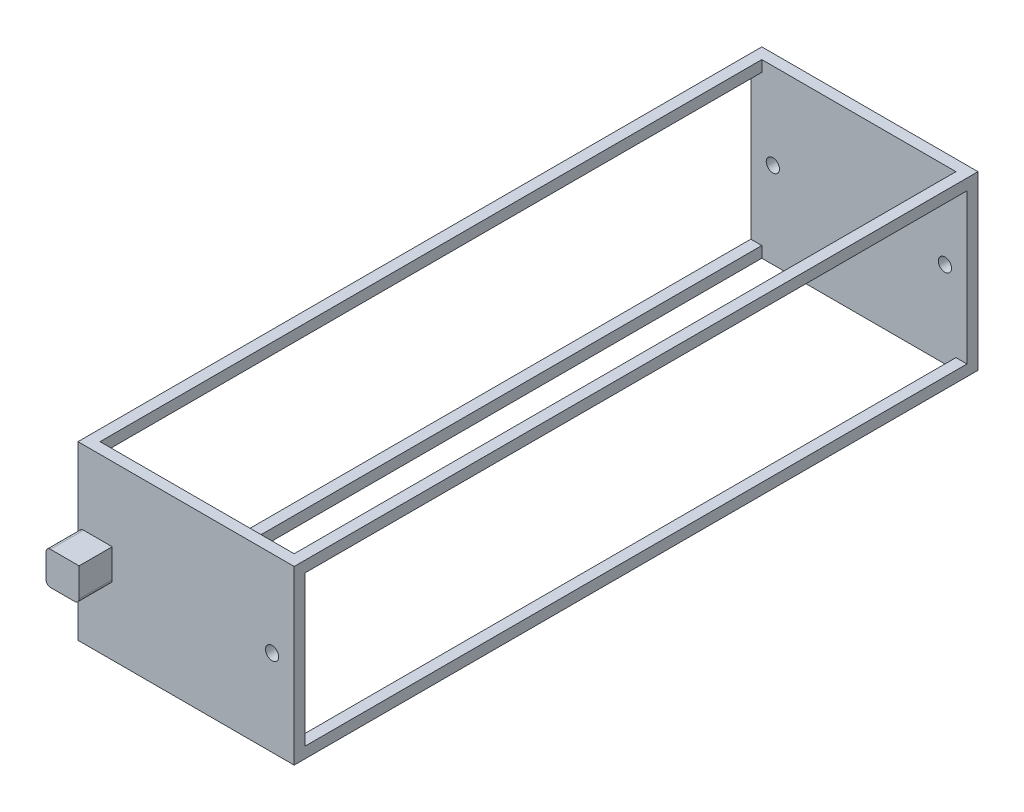
ISO-10303-21;
HEADER;
FILE_DESCRIPTION(('STEP AP214'),'2;1');
FILE_NAME('part.step','',(''),(''),'','','');
FILE_SCHEMA(('AUTOMOTIVE_DESIGN { 1 0 10303 214 1 1 1 1 }'));
ENDSEC;
DATA;
#1=APPLICATION_CONTEXT('core data for automotive mechanical design processes');
#2=APPLICATION_PROTOCOL_DEFINITION('international standard','automotive_design',2000,#1);
#3=PRODUCT_CONTEXT('',#1,'mechanical');
#4=PRODUCT('Part','Part','',(#3));
#5=PRODUCT_RELATED_PRODUCT_CATEGORY('part','',(#4));
#6=PRODUCT_DEFINITION_FORMATION('','',#4);
#7=PRODUCT_DEFINITION_CONTEXT('part definition',#1,'design');
#8=PRODUCT_DEFINITION('design','',#6,#7);
#9=PRODUCT_DEFINITION_SHAPE('','',#8);
#10=(LENGTH_UNIT() NAMED_UNIT(*) SI_UNIT(.MILLI.,.METRE.));
#11=(NAMED_UNIT(*) PLANE_ANGLE_UNIT() SI_UNIT($,.RADIAN.));
#12=(NAMED_UNIT(*) SI_UNIT($,.STERADIAN.) SOLID_ANGLE_UNIT());
#13=UNCERTAINTY_MEASURE_WITH_UNIT(LENGTH_MEASURE(1.E-05),#10,'distance_accuracy_value','');
#14=(GEOMETRIC_REPRESENTATION_CONTEXT(3) GLOBAL_UNCERTAINTY_ASSIGNED_CONTEXT((#13)) GLOBAL_UNIT_ASSIGNED_CONTEXT((#10,
#11,#12)) REPRESENTATION_CONTEXT('',''));
#15=CARTESIAN_POINT('',(0.,0.,0.));
#16=DIRECTION('',(0.,0.,1.));
#17=DIRECTION('',(1.,0.,0.));
#18=AXIS2_PLACEMENT_3D('',#15,#16,#17);
#19=CARTESIAN_POINT('',(30.,-175.,1560.));
#20=DIRECTION('',(0.,0.,-1.));
#21=DIRECTION('',(-1.,0.,0.));
#22=AXIS2_PLACEMENT_3D('',#19,#20,#21);
#23=CYLINDRICAL_SURFACE('',#22,13.7090130169661);
#24=CARTESIAN_POINT('',(30.,-175.,1560.));
#25=DIRECTION('',(0.,0.,1.));
#26=DIRECTION('',(1.,0.,0.));
#27=AXIS2_PLACEMENT_3D('',#24,#25,#26);
#28=CIRCLE('',#27,13.7090130169661);
#29=CARTESIAN_POINT('',(43.7090130169661,-175.,1560.));
#30=VERTEX_POINT('',#29);
#31=EDGE_CURVE('E131',#30,#30,#28,.T.);
#32=ORIENTED_EDGE('',*,*,#31,.F.);
#33=EDGE_LOOP('',(#32));
#34=FACE_BOUND('',#33,.T.);
#35=CARTESIAN_POINT('',(30.,-175.,1550.));
#36=DIRECTION('',(0.,0.,1.));
#37=DIRECTION('',(1.,0.,0.));
#38=AXIS2_PLACEMENT_3D('',#35,#36,#37);
#39=CIRCLE('',#38,13.7090130169661);
#40=CARTESIAN_POINT('',(43.7090130169661,-175.,1550.));
#41=VERTEX_POINT('',#40);
#42=EDGE_CURVE('E127',#41,#41,#39,.T.);
#43=ORIENTED_EDGE('',*,*,#42,.T.);
#44=EDGE_LOOP('',(#43));
#45=FACE_BOUND('',#44,.T.);
#46=ADVANCED_FACE('F45',(#34,#45),#23,.T.);
#47=CARTESIAN_POINT('',(30.,-175.,1550.));
#48=DIRECTION('',(0.,0.,1.));
#49=DIRECTION('',(1.,0.,0.));
#50=AXIS2_PLACEMENT_3D('',#47,#48,#49);
#51=PLANE('',#50);
#52=ORIENTED_EDGE('',*,*,#42,.F.);
#53=EDGE_LOOP('',(#52));
#54=FACE_BOUND('',#53,.T.);
#55=ADVANCED_FACE('F191',(#54),#51,.F.);
#56=CARTESIAN_POINT('',(67.5,-137.5,1635.));
#57=DIRECTION('',(-1.,0.,0.));
#58=DIRECTION('',(0.,-1.,0.));
#59=AXIS2_PLACEMENT_3D('',#56,#57,#58);
#60=PLANE('',#59);
#61=DIRECTION('',(0.,1.,0.));
#62=VECTOR('',#61,1.);
#63=CARTESIAN_POINT('',(67.5,-137.5,1635.));
#64=LINE('',#63,#62);
#65=CARTESIAN_POINT('',(67.5,-202.5,1635.));
#66=VERTEX_POINT('',#65);
#67=CARTESIAN_POINT('',(67.5,-137.5,1635.));
#68=VERTEX_POINT('',#67);
#69=EDGE_CURVE('E102',#66,#68,#64,.T.);
#70=ORIENTED_EDGE('',*,*,#69,.F.);
#71=DIRECTION('',(0.,0.,-1.));
#72=VECTOR('',#71,1.);
#73=CARTESIAN_POINT('',(67.5,-202.5,1635.));
#74=LINE('',#73,#72);
#75=CARTESIAN_POINT('',(67.5,-202.5,1560.));
#76=VERTEX_POINT('',#75);
#77=EDGE_CURVE('E138',#66,#76,#74,.T.);
#78=ORIENTED_EDGE('',*,*,#77,.T.);
#79=DIRECTION('',(0.,1.,0.));
#80=VECTOR('',#79,1.);
#81=CARTESIAN_POINT('',(67.5,-137.5,1560.));
#82=LINE('',#81,#80);
#83=CARTESIAN_POINT('',(67.5,-137.5,1560.));
#84=VERTEX_POINT('',#83);
#85=EDGE_CURVE('E125',#76,#84,#82,.T.);
#86=ORIENTED_EDGE('',*,*,#85,.T.);
#87=DIRECTION('',(0.,0.,-1.));
#88=VECTOR('',#87,1.);
#89=CARTESIAN_POINT('',(67.5,-137.5,1635.));
#90=LINE('',#89,#88);
#91=EDGE_CURVE('E119',#68,#84,#90,.T.);
#92=ORIENTED_EDGE('',*,*,#91,.F.);
#93=EDGE_LOOP('',(#70,#78,#86,#92));
#94=FACE_BOUND('',#93,.T.);
#95=ADVANCED_FACE('F123',(#94),#60,.F.);
#96=CARTESIAN_POINT('',(-7.49999999999998,-137.5,1635.));
#97=DIRECTION('',(0.,-1.,0.));
#98=DIRECTION('',(0.,0.,-1.));
#99=AXIS2_PLACEMENT_3D('',#96,#97,#98);
#100=PLANE('',#99);
#101=DIRECTION('',(-1.,0.,0.));
#102=VECTOR('',#101,1.);
#103=CARTESIAN_POINT('',(-7.49999999999998,-137.5,1560.));
#104=LINE('',#103,#102);
#105=CARTESIAN_POINT('',(2.50000000000002,-137.5,1560.));
#106=VERTEX_POINT('',#105);
#107=EDGE_CURVE('E166',#84,#106,#104,.T.);
#108=ORIENTED_EDGE('',*,*,#107,.T.);
#109=DIRECTION('',(0.,0.,-1.));
#110=VECTOR('',#109,1.);
#111=CARTESIAN_POINT('',(2.50000000000002,-137.5,1635.));
#112=LINE('',#111,#110);
#113=CARTESIAN_POINT('',(2.50000000000002,-137.5,1635.));
#114=VERTEX_POINT('',#113);
#115=EDGE_CURVE('E12',#106,#114,#112,.F.);
#116=ORIENTED_EDGE('',*,*,#115,.T.);
#117=DIRECTION('',(-1.,0.,0.));
#118=VECTOR('',#117,1.);
#119=CARTESIAN_POINT('',(-7.49999999999998,-137.5,1635.));
#120=LINE('',#119,#118);
#121=EDGE_CURVE('E106',#68,#114,#120,.T.);
#122=ORIENTED_EDGE('',*,*,#121,.F.);
#123=ORIENTED_EDGE('',*,*,#91,.T.);
#124=EDGE_LOOP('',(#108,#116,#122,#123));
#125=FACE_BOUND('',#124,.T.);
#126=ADVANCED_FACE('F118',(#125),#100,.F.);
#127=CARTESIAN_POINT('',(-7.49999999999998,-137.5,1635.));
#128=DIRECTION('',(1.,0.,0.));
#129=DIRECTION('',(0.,1.,0.));
#130=AXIS2_PLACEMENT_3D('',#127,#128,#129);
#131=PLANE('',#130);
#132=DIRECTION('',(0.,-1.,0.));
#133=VECTOR('',#132,1.);
#134=CARTESIAN_POINT('',(-7.49999999999998,-137.5,1560.));
#135=LINE('',#134,#133);
#136=CARTESIAN_POINT('',(-7.49999999999998,-147.5,1560.));
#137=VERTEX_POINT('',#136);
#138=CARTESIAN_POINT('',(-7.49999999999997,-202.5,1560.));
#139=VERTEX_POINT('',#138);
#140=EDGE_CURVE('E161',#137,#139,#135,.T.);
#141=ORIENTED_EDGE('',*,*,#140,.T.);
#142=DIRECTION('',(0.,0.,-1.));
#143=VECTOR('',#142,1.);
#144=CARTESIAN_POINT('',(-7.49999999999997,-202.5,1635.));
#145=LINE('',#144,#143);
#146=CARTESIAN_POINT('',(-7.49999999999997,-202.5,1635.));
#147=VERTEX_POINT('',#146);
#148=EDGE_CURVE('E53',#139,#147,#145,.F.);
#149=ORIENTED_EDGE('',*,*,#148,.T.);
#150=DIRECTION('',(0.,-1.,0.));
#151=VECTOR('',#150,1.);
#152=CARTESIAN_POINT('',(-7.49999999999998,-137.5,1635.));
#153=LINE('',#152,#151);
#154=CARTESIAN_POINT('',(-7.49999999999998,-147.5,1635.));
#155=VERTEX_POINT('',#154);
#156=EDGE_CURVE('E121',#155,#147,#153,.T.);
#157=ORIENTED_EDGE('',*,*,#156,.F.);
#158=DIRECTION('',(0.,0.,-1.));
#159=VECTOR('',#158,1.);
#160=CARTESIAN_POINT('',(-7.49999999999998,-147.5,1635.));
#161=LINE('',#160,#159);
#162=EDGE_CURVE('E156',#155,#137,#161,.T.);
#163=ORIENTED_EDGE('',*,*,#162,.T.);
#164=EDGE_LOOP('',(#141,#149,#157,#163));
#165=FACE_BOUND('',#164,.T.);
#166=ADVANCED_FACE('F160',(#165),#131,.F.);
#167=CARTESIAN_POINT('',(-7.49999999999997,-212.5,1635.));
#168=DIRECTION('',(0.,1.,0.));
#169=DIRECTION('',(0.,0.,1.));
#170=AXIS2_PLACEMENT_3D('',#167,#168,#169);
#171=PLANE('',#170);
#172=DIRECTION('',(1.,0.,0.));
#173=VECTOR('',#172,1.);
#174=CARTESIAN_POINT('',(-7.49999999999997,-212.5,1560.));
#175=LINE('',#174,#173);
#176=CARTESIAN_POINT('',(2.50000000000003,-212.5,1560.));
#177=VERTEX_POINT('',#176);
#178=CARTESIAN_POINT('',(57.5,-212.5,1560.));
#179=VERTEX_POINT('',#178);
#180=EDGE_CURVE('E113',#177,#179,#175,.T.);
#181=ORIENTED_EDGE('',*,*,#180,.T.);
#182=DIRECTION('',(0.,0.,-1.));
#183=VECTOR('',#182,1.);
#184=CARTESIAN_POINT('',(57.5,-212.5,1635.));
#185=LINE('',#184,#183);
#186=CARTESIAN_POINT('',(57.5,-212.5,1635.));
#187=VERTEX_POINT('',#186);
#188=EDGE_CURVE('E150',#179,#187,#185,.F.);
#189=ORIENTED_EDGE('',*,*,#188,.T.);
#190=DIRECTION('',(1.,0.,0.));
#191=VECTOR('',#190,1.);
#192=CARTESIAN_POINT('',(-7.49999999999997,-212.5,1635.));
#193=LINE('',#192,#191);
#194=CARTESIAN_POINT('',(2.50000000000003,-212.5,1635.));
#195=VERTEX_POINT('',#194);
#196=EDGE_CURVE('E128',#195,#187,#193,.T.);
#197=ORIENTED_EDGE('',*,*,#196,.F.);
#198=DIRECTION('',(0.,0.,-1.));
#199=VECTOR('',#198,1.);
#200=CARTESIAN_POINT('',(2.50000000000003,-212.5,1635.));
#201=LINE('',#200,#199);
#202=EDGE_CURVE('E147',#195,#177,#201,.T.);
#203=ORIENTED_EDGE('',*,*,#202,.T.);
#204=EDGE_LOOP('',(#181,#189,#197,#203));
#205=FACE_BOUND('',#204,.T.);
#206=ADVANCED_FACE('F177',(#205),#171,.F.);
#207=CARTESIAN_POINT('',(0.,0.,1635.));
#208=DIRECTION('',(0.,0.,1.));
#209=DIRECTION('',(1.,0.,0.));
#210=AXIS2_PLACEMENT_3D('',#207,#208,#209);
#211=PLANE('',#210);
#212=ORIENTED_EDGE('',*,*,#196,.T.);
#213=CARTESIAN_POINT('',(57.5,-202.5,1635.));
#214=DIRECTION('',(0.,0.,1.));
#215=DIRECTION('',(1.,0.,0.));
#216=AXIS2_PLACEMENT_3D('',#213,#214,#215);
#217=CIRCLE('',#216,10.);
#218=EDGE_CURVE('E108',#187,#66,#217,.T.);
#219=ORIENTED_EDGE('',*,*,#218,.T.);
#220=ORIENTED_EDGE('',*,*,#69,.T.);
#221=ORIENTED_EDGE('',*,*,#121,.T.);
#222=CARTESIAN_POINT('',(2.50000000000002,-147.5,1635.));
#223=DIRECTION('',(0.,0.,1.));
#224=DIRECTION('',(1.,0.,0.));
#225=AXIS2_PLACEMENT_3D('',#222,#223,#224);
#226=CIRCLE('',#225,10.);
#227=EDGE_CURVE('E66',#114,#155,#226,.T.);
#228=ORIENTED_EDGE('',*,*,#227,.T.);
#229=ORIENTED_EDGE('',*,*,#156,.T.);
#230=CARTESIAN_POINT('',(2.50000000000003,-202.5,1635.));
#231=DIRECTION('',(0.,0.,1.));
#232=DIRECTION('',(1.,0.,0.));
#233=AXIS2_PLACEMENT_3D('',#230,#231,#232);
#234=CIRCLE('',#233,10.);
#235=EDGE_CURVE('E153',#147,#195,#234,.T.);
#236=ORIENTED_EDGE('',*,*,#235,.T.);
#237=EDGE_LOOP('',(#212,#219,#220,#221,#228,#229,#236));
#238=FACE_BOUND('',#237,.T.);
#239=ADVANCED_FACE('F105',(#238),#211,.T.);
#240=CARTESIAN_POINT('',(0.,0.,1560.));
#241=DIRECTION('',(0.,0.,1.));
#242=DIRECTION('',(1.,0.,0.));
#243=AXIS2_PLACEMENT_3D('',#240,#241,#242);
#244=PLANE('',#243);
#245=ORIENTED_EDGE('',*,*,#31,.T.);
#246=EDGE_LOOP('',(#245));
#247=FACE_BOUND('',#246,.T.);
#248=ORIENTED_EDGE('',*,*,#85,.F.);
#249=CARTESIAN_POINT('',(57.5,-202.5,1560.));
#250=DIRECTION('',(0.,0.,1.));
#251=DIRECTION('',(1.,0.,0.));
#252=AXIS2_PLACEMENT_3D('',#249,#250,#251);
#253=CIRCLE('',#252,10.);
#254=EDGE_CURVE('E145',#76,#179,#253,.F.);
#255=ORIENTED_EDGE('',*,*,#254,.T.);
#256=ORIENTED_EDGE('',*,*,#180,.F.);
#257=CARTESIAN_POINT('',(2.50000000000003,-202.5,1560.));
#258=DIRECTION('',(0.,0.,1.));
#259=DIRECTION('',(1.,0.,0.));
#260=AXIS2_PLACEMENT_3D('',#257,#258,#259);
#261=CIRCLE('',#260,10.);
#262=EDGE_CURVE('E143',#177,#139,#261,.F.);
#263=ORIENTED_EDGE('',*,*,#262,.T.);
#264=ORIENTED_EDGE('',*,*,#140,.F.);
#265=CARTESIAN_POINT('',(2.50000000000002,-147.5,1560.));
#266=DIRECTION('',(0.,0.,1.));
#267=DIRECTION('',(1.,0.,0.));
#268=AXIS2_PLACEMENT_3D('',#265,#266,#267);
#269=CIRCLE('',#268,10.);
#270=EDGE_CURVE('E141',#137,#106,#269,.F.);
#271=ORIENTED_EDGE('',*,*,#270,.T.);
#272=ORIENTED_EDGE('',*,*,#107,.F.);
#273=EDGE_LOOP('',(#248,#255,#256,#263,#264,#271,#272));
#274=FACE_BOUND('',#273,.T.);
#275=ADVANCED_FACE('F164',(#247,#274),#244,.F.);
#276=CARTESIAN_POINT('',(57.5,-202.5,1635.));
#277=DIRECTION('',(0.,0.,-1.));
#278=DIRECTION('',(-1.,0.,0.));
#279=AXIS2_PLACEMENT_3D('',#276,#277,#278);
#280=CYLINDRICAL_SURFACE('',#279,10.);
#281=ORIENTED_EDGE('',*,*,#218,.F.);
#282=ORIENTED_EDGE('',*,*,#188,.F.);
#283=ORIENTED_EDGE('',*,*,#254,.F.);
#284=ORIENTED_EDGE('',*,*,#77,.F.);
#285=EDGE_LOOP('',(#281,#282,#283,#284));
#286=FACE_BOUND('',#285,.T.);
#287=ADVANCED_FACE('F180',(#286),#280,.T.);
#288=CARTESIAN_POINT('',(2.50000000000003,-202.5,1635.));
#289=DIRECTION('',(0.,0.,-1.));
#290=DIRECTION('',(-1.,0.,0.));
#291=AXIS2_PLACEMENT_3D('',#288,#289,#290);
#292=CYLINDRICAL_SURFACE('',#291,10.);
#293=ORIENTED_EDGE('',*,*,#235,.F.);
#294=ORIENTED_EDGE('',*,*,#148,.F.);
#295=ORIENTED_EDGE('',*,*,#262,.F.);
#296=ORIENTED_EDGE('',*,*,#202,.F.);
#297=EDGE_LOOP('',(#293,#294,#295,#296));
#298=FACE_BOUND('',#297,.T.);
#299=ADVANCED_FACE('F175',(#298),#292,.T.);
#300=CARTESIAN_POINT('',(2.50000000000002,-147.5,1635.));
#301=DIRECTION('',(0.,0.,-1.));
#302=DIRECTION('',(-1.,0.,0.));
#303=AXIS2_PLACEMENT_3D('',#300,#301,#302);
#304=CYLINDRICAL_SURFACE('',#303,10.);
#305=ORIENTED_EDGE('',*,*,#227,.F.);
#306=ORIENTED_EDGE('',*,*,#115,.F.);
#307=ORIENTED_EDGE('',*,*,#270,.F.);
#308=ORIENTED_EDGE('',*,*,#162,.F.);
#309=EDGE_LOOP('',(#305,#306,#307,#308));
#310=FACE_BOUND('',#309,.T.);
#311=ADVANCED_FACE('F47',(#310),#304,.T.);
#312=CLOSED_SHELL('',(#46,#55,#95,#126,#166,#206,#239,#275,#287,#299,#311));
#313=MANIFOLD_SOLID_BREP('B2',#312);
#314=CARTESIAN_POINT('',(0.,0.,25.));
#315=DIRECTION('',(0.,0.,-1.));
#316=DIRECTION('',(-1.,0.,0.));
#317=AXIS2_PLACEMENT_3D('',#314,#315,#316);
#318=PLANE('',#317);
#319=CARTESIAN_POINT('',(420.,-175.,25.));
#320=DIRECTION('',(0.,0.,-1.));
#321=DIRECTION('',(-1.,0.,0.));
#322=AXIS2_PLACEMENT_3D('',#319,#320,#321);
#323=CIRCLE('',#322,15.);
#324=CARTESIAN_POINT('',(405.,-175.,25.));
#325=VERTEX_POINT('',#324);
#326=EDGE_CURVE('E416',#325,#325,#323,.T.);
#327=ORIENTED_EDGE('',*,*,#326,.T.);
#328=EDGE_LOOP('',(#327));
#329=FACE_BOUND('',#328,.T.);
#330=CARTESIAN_POINT('',(30.,-175.,25.));
#331=DIRECTION('',(0.,0.,-1.));
#332=DIRECTION('',(-1.,0.,0.));
#333=AXIS2_PLACEMENT_3D('',#330,#331,#332);
#334=CIRCLE('',#333,15.);
#335=CARTESIAN_POINT('',(15.,-175.,25.));
#336=VERTEX_POINT('',#335);
#337=EDGE_CURVE('E782',#336,#336,#334,.T.);
#338=ORIENTED_EDGE('',*,*,#337,.T.);
#339=EDGE_LOOP('',(#338));
#340=FACE_BOUND('',#339,.T.);
#341=DIRECTION('',(0.,1.,0.));
#342=VECTOR('',#341,1.);
#343=CARTESIAN_POINT('',(4.99999999999999,-370.,25.));
#344=LINE('',#343,#342);
#345=CARTESIAN_POINT('',(4.99999999999999,-370.,25.));
#346=VERTEX_POINT('',#345);
#347=CARTESIAN_POINT('',(5.,-345.,25.));
#348=VERTEX_POINT('',#347);
#349=EDGE_CURVE('E421',#346,#348,#344,.T.);
#350=ORIENTED_EDGE('',*,*,#349,.F.);
#351=DIRECTION('',(1.,0.,0.));
#352=VECTOR('',#351,1.);
#353=CARTESIAN_POINT('',(-20.,-370.,25.));
#354=LINE('',#353,#352);
#355=CARTESIAN_POINT('',(445.,-370.,25.));
#356=VERTEX_POINT('',#355);
#357=EDGE_CURVE('E515',#346,#356,#354,.T.);
#358=ORIENTED_EDGE('',*,*,#357,.T.);
#359=DIRECTION('',(0.,-1.,0.));
#360=VECTOR('',#359,1.);
#361=CARTESIAN_POINT('',(445.,-370.,25.));
#362=LINE('',#361,#360);
#363=CARTESIAN_POINT('',(445.,-345.,25.));
#364=VERTEX_POINT('',#363);
#365=EDGE_CURVE('E452',#364,#356,#362,.T.);
#366=ORIENTED_EDGE('',*,*,#365,.F.);
#367=DIRECTION('',(-1.,0.,0.));
#368=VECTOR('',#367,1.);
#369=CARTESIAN_POINT('',(470.,-345.,25.));
#370=LINE('',#369,#368);
#371=CARTESIAN_POINT('',(470.,-345.,25.));
#372=VERTEX_POINT('',#371);
#373=EDGE_CURVE('E447',#372,#364,#370,.T.);
#374=ORIENTED_EDGE('',*,*,#373,.F.);
#375=DIRECTION('',(0.,1.,0.));
#376=VECTOR('',#375,1.);
#377=CARTESIAN_POINT('',(470.,20.,25.));
#378=LINE('',#377,#376);
#379=CARTESIAN_POINT('',(470.,-5.00000000000005,25.));
#380=VERTEX_POINT('',#379);
#381=EDGE_CURVE('E517',#372,#380,#378,.T.);
#382=ORIENTED_EDGE('',*,*,#381,.T.);
#383=DIRECTION('',(1.,0.,0.));
#384=VECTOR('',#383,1.);
#385=CARTESIAN_POINT('',(470.,-5.00000000000005,25.));
#386=LINE('',#385,#384);
#387=CARTESIAN_POINT('',(445.,-5.00000000000005,25.));
#388=VERTEX_POINT('',#387);
#389=EDGE_CURVE('E473',#388,#380,#386,.T.);
#390=ORIENTED_EDGE('',*,*,#389,.F.);
#391=DIRECTION('',(0.,-1.,0.));
#392=VECTOR('',#391,1.);
#393=CARTESIAN_POINT('',(445.,20.,25.));
#394=LINE('',#393,#392);
#395=CARTESIAN_POINT('',(445.,20.,25.));
#396=VERTEX_POINT('',#395);
#397=EDGE_CURVE('E468',#396,#388,#394,.T.);
#398=ORIENTED_EDGE('',*,*,#397,.F.);
#399=DIRECTION('',(-1.,0.,0.));
#400=VECTOR('',#399,1.);
#401=CARTESIAN_POINT('',(-20.,20.,25.));
#402=LINE('',#401,#400);
#403=CARTESIAN_POINT('',(5.00000000000002,20.,25.));
#404=VERTEX_POINT('',#403);
#405=EDGE_CURVE('E511',#396,#404,#402,.T.);
#406=ORIENTED_EDGE('',*,*,#405,.T.);
#407=DIRECTION('',(0.,1.,0.));
#408=VECTOR('',#407,1.);
#409=CARTESIAN_POINT('',(5.00000000000002,20.,25.));
#410=LINE('',#409,#408);
#411=CARTESIAN_POINT('',(5.00000000000002,-5.00000000000002,25.));
#412=VERTEX_POINT('',#411);
#413=EDGE_CURVE('E494',#412,#404,#410,.T.);
#414=ORIENTED_EDGE('',*,*,#413,.F.);
#415=DIRECTION('',(1.,0.,0.));
#416=VECTOR('',#415,1.);
#417=CARTESIAN_POINT('',(-20.,-5.00000000000002,25.));
#418=LINE('',#417,#416);
#419=CARTESIAN_POINT('',(-20.,-5.00000000000002,25.));
#420=VERTEX_POINT('',#419);
#421=EDGE_CURVE('E489',#420,#412,#418,.T.);
#422=ORIENTED_EDGE('',*,*,#421,.F.);
#423=DIRECTION('',(0.,-1.,0.));
#424=VECTOR('',#423,1.);
#425=CARTESIAN_POINT('',(-20.,20.,25.));
#426=LINE('',#425,#424);
#427=CARTESIAN_POINT('',(-20.,-345.,25.));
#428=VERTEX_POINT('',#427);
#429=EDGE_CURVE('E296',#420,#428,#426,.T.);
#430=ORIENTED_EDGE('',*,*,#429,.T.);
#431=DIRECTION('',(-1.,0.,0.));
#432=VECTOR('',#431,1.);
#433=CARTESIAN_POINT('',(-20.,-345.,25.));
#434=LINE('',#433,#432);
#435=EDGE_CURVE('E291',#348,#428,#434,.T.);
#436=ORIENTED_EDGE('',*,*,#435,.F.);
#437=EDGE_LOOP('',(#350,#358,#366,#374,#382,#390,#398,#406,#414,#422,#430,#436));
#438=FACE_BOUND('',#437,.T.);
#439=ADVANCED_FACE('F276',(#329,#340,#438),#318,.F.);
#440=CARTESIAN_POINT('',(-20.,20.,25.));
#441=DIRECTION('',(0.,-1.,0.));
#442=DIRECTION('',(0.,0.,-1.));
#443=AXIS2_PLACEMENT_3D('',#440,#441,#442);
#444=PLANE('',#443);
#445=DIRECTION('',(0.,0.,-1.));
#446=VECTOR('',#445,1.);
#447=CARTESIAN_POINT('',(-20.,20.,25.));
#448=LINE('',#447,#446);
#449=CARTESIAN_POINT('',(-20.,20.,1550.));
#450=VERTEX_POINT('',#449);
#451=CARTESIAN_POINT('',(-20.,20.,0.));
#452=VERTEX_POINT('',#451);
#453=EDGE_CURVE('E43',#450,#452,#448,.T.);
#454=ORIENTED_EDGE('',*,*,#453,.F.);
#455=DIRECTION('',(-1.,0.,0.));
#456=VECTOR('',#455,1.);
#457=CARTESIAN_POINT('',(-20.,20.,1550.));
#458=LINE('',#457,#456);
#459=CARTESIAN_POINT('',(470.,20.,1550.));
#460=VERTEX_POINT('',#459);
#461=EDGE_CURVE('E409',#460,#450,#458,.T.);
#462=ORIENTED_EDGE('',*,*,#461,.F.);
#463=DIRECTION('',(0.,0.,-1.));
#464=VECTOR('',#463,1.);
#465=CARTESIAN_POINT('',(470.,20.,25.));
#466=LINE('',#465,#464);
#467=CARTESIAN_POINT('',(470.,20.,0.));
#468=VERTEX_POINT('',#467);
#469=EDGE_CURVE('E519',#460,#468,#466,.T.);
#470=ORIENTED_EDGE('',*,*,#469,.T.);
#471=DIRECTION('',(-1.,0.,0.));
#472=VECTOR('',#471,1.);
#473=CARTESIAN_POINT('',(-20.,20.,0.));
#474=LINE('',#473,#472);
#475=EDGE_CURVE('E510',#468,#452,#474,.T.);
#476=ORIENTED_EDGE('',*,*,#475,.T.);
#477=EDGE_LOOP('',(#454,#462,#470,#476));
#478=FACE_BOUND('',#477,.T.);
#479=DIRECTION('',(-1.,0.,0.));
#480=VECTOR('',#479,1.);
#481=CARTESIAN_POINT('',(-20.,20.,1525.));
#482=LINE('',#481,#480);
#483=CARTESIAN_POINT('',(445.,20.,1525.));
#484=VERTEX_POINT('',#483);
#485=CARTESIAN_POINT('',(5.00000000000002,20.,1525.));
#486=VERTEX_POINT('',#485);
#487=EDGE_CURVE('E410',#484,#486,#482,.T.);
#488=ORIENTED_EDGE('',*,*,#487,.T.);
#489=DIRECTION('',(0.,0.,-1.));
#490=VECTOR('',#489,1.);
#491=CARTESIAN_POINT('',(5.00000000000002,20.,1525.));
#492=LINE('',#491,#490);
#493=EDGE_CURVE('E497',#486,#404,#492,.T.);
#494=ORIENTED_EDGE('',*,*,#493,.T.);
#495=ORIENTED_EDGE('',*,*,#405,.F.);
#496=DIRECTION('',(0.,0.,-1.));
#497=VECTOR('',#496,1.);
#498=CARTESIAN_POINT('',(445.,20.,1525.));
#499=LINE('',#498,#497);
#500=EDGE_CURVE('E486',#484,#396,#499,.T.);
#501=ORIENTED_EDGE('',*,*,#500,.F.);
#502=EDGE_LOOP('',(#488,#494,#495,#501));
#503=FACE_BOUND('',#502,.T.);
#504=ADVANCED_FACE('F278',(#478,#503),#444,.F.);
#505=CARTESIAN_POINT('',(-20.,20.,25.));
#506=DIRECTION('',(1.,0.,0.));
#507=DIRECTION('',(0.,0.,-1.));
#508=AXIS2_PLACEMENT_3D('',#505,#506,#507);
#509=PLANE('',#508);
#510=DIRECTION('',(0.,0.,-1.));
#511=VECTOR('',#510,1.);
#512=CARTESIAN_POINT('',(-20.,-5.00000000000002,1525.));
#513=LINE('',#512,#511);
#514=CARTESIAN_POINT('',(-20.,-5.00000000000002,1525.));
#515=VERTEX_POINT('',#514);
#516=EDGE_CURVE('E507',#515,#420,#513,.T.);
#517=ORIENTED_EDGE('',*,*,#516,.F.);
#518=DIRECTION('',(0.,-1.,0.));
#519=VECTOR('',#518,1.);
#520=CARTESIAN_POINT('',(-20.,20.,1525.));
#521=LINE('',#520,#519);
#522=CARTESIAN_POINT('',(-20.,-345.,1525.));
#523=VERTEX_POINT('',#522);
#524=EDGE_CURVE('E422',#515,#523,#521,.T.);
#525=ORIENTED_EDGE('',*,*,#524,.T.);
#526=DIRECTION('',(0.,0.,-1.));
#527=VECTOR('',#526,1.);
#528=CARTESIAN_POINT('',(-20.,-345.,1525.));
#529=LINE('',#528,#527);
#530=EDGE_CURVE('E436',#523,#428,#529,.T.);
#531=ORIENTED_EDGE('',*,*,#530,.T.);
#532=ORIENTED_EDGE('',*,*,#429,.F.);
#533=EDGE_LOOP('',(#517,#525,#531,#532));
#534=FACE_BOUND('',#533,.T.);
#535=DIRECTION('',(0.,-1.,0.));
#536=VECTOR('',#535,1.);
#537=CARTESIAN_POINT('',(-20.,20.,0.));
#538=LINE('',#537,#536);
#539=CARTESIAN_POINT('',(-20.,-370.,0.));
#540=VERTEX_POINT('',#539);
#541=EDGE_CURVE('E392',#452,#540,#538,.T.);
#542=ORIENTED_EDGE('',*,*,#541,.T.);
#543=DIRECTION('',(0.,0.,-1.));
#544=VECTOR('',#543,1.);
#545=CARTESIAN_POINT('',(-20.,-370.,25.));
#546=LINE('',#545,#544);
#547=CARTESIAN_POINT('',(-20.,-370.,1550.));
#548=VERTEX_POINT('',#547);
#549=EDGE_CURVE('E284',#548,#540,#546,.T.);
#550=ORIENTED_EDGE('',*,*,#549,.F.);
#551=DIRECTION('',(0.,-1.,0.));
#552=VECTOR('',#551,1.);
#553=CARTESIAN_POINT('',(-20.,20.,1550.));
#554=LINE('',#553,#552);
#555=EDGE_CURVE('E391',#450,#548,#554,.T.);
#556=ORIENTED_EDGE('',*,*,#555,.F.);
#557=ORIENTED_EDGE('',*,*,#453,.T.);
#558=EDGE_LOOP('',(#542,#550,#556,#557));
#559=FACE_BOUND('',#558,.T.);
#560=ADVANCED_FACE('F389',(#534,#559),#509,.F.);
#561=CARTESIAN_POINT('',(-20.,-370.,25.));
#562=DIRECTION('',(0.,1.,0.));
#563=DIRECTION('',(0.,0.,1.));
#564=AXIS2_PLACEMENT_3D('',#561,#562,#563);
#565=PLANE('',#564);
#566=DIRECTION('',(0.,0.,-1.));
#567=VECTOR('',#566,1.);
#568=CARTESIAN_POINT('',(470.,-370.,25.));
#569=LINE('',#568,#567);
#570=CARTESIAN_POINT('',(470.,-370.,1550.));
#571=VERTEX_POINT('',#570);
#572=CARTESIAN_POINT('',(470.,-370.,0.));
#573=VERTEX_POINT('',#572);
#574=EDGE_CURVE('E395',#571,#573,#569,.T.);
#575=ORIENTED_EDGE('',*,*,#574,.F.);
#576=DIRECTION('',(1.,0.,0.));
#577=VECTOR('',#576,1.);
#578=CARTESIAN_POINT('',(-20.,-370.,1550.));
#579=LINE('',#578,#577);
#580=EDGE_CURVE('E397',#548,#571,#579,.T.);
#581=ORIENTED_EDGE('',*,*,#580,.F.);
#582=ORIENTED_EDGE('',*,*,#549,.T.);
#583=DIRECTION('',(1.,0.,0.));
#584=VECTOR('',#583,1.);
#585=CARTESIAN_POINT('',(-20.,-370.,0.));
#586=LINE('',#585,#584);
#587=EDGE_CURVE('E523',#540,#573,#586,.T.);
#588=ORIENTED_EDGE('',*,*,#587,.T.);
#589=EDGE_LOOP('',(#575,#581,#582,#588));
#590=FACE_BOUND('',#589,.T.);
#591=DIRECTION('',(1.,0.,0.));
#592=VECTOR('',#591,1.);
#593=CARTESIAN_POINT('',(-20.,-370.,1525.));
#594=LINE('',#593,#592);
#595=CARTESIAN_POINT('',(5.,-370.,1525.));
#596=VERTEX_POINT('',#595);
#597=CARTESIAN_POINT('',(445.,-370.,1525.));
#598=VERTEX_POINT('',#597);
#599=EDGE_CURVE('E425',#596,#598,#594,.T.);
#600=ORIENTED_EDGE('',*,*,#599,.T.);
#601=DIRECTION('',(0.,0.,-1.));
#602=VECTOR('',#601,1.);
#603=CARTESIAN_POINT('',(445.,-370.,1525.));
#604=LINE('',#603,#602);
#605=EDGE_CURVE('E455',#598,#356,#604,.T.);
#606=ORIENTED_EDGE('',*,*,#605,.T.);
#607=ORIENTED_EDGE('',*,*,#357,.F.);
#608=DIRECTION('',(0.,0.,-1.));
#609=VECTOR('',#608,1.);
#610=CARTESIAN_POINT('',(4.99999999999999,-370.,1525.));
#611=LINE('',#610,#609);
#612=EDGE_CURVE('E444',#596,#346,#611,.T.);
#613=ORIENTED_EDGE('',*,*,#612,.F.);
#614=EDGE_LOOP('',(#600,#606,#607,#613));
#615=FACE_BOUND('',#614,.T.);
#616=ADVANCED_FACE('F398',(#590,#615),#565,.F.);
#617=CARTESIAN_POINT('',(470.,20.,25.));
#618=DIRECTION('',(-1.,0.,0.));
#619=DIRECTION('',(0.,0.,1.));
#620=AXIS2_PLACEMENT_3D('',#617,#618,#619);
#621=PLANE('',#620);
#622=ORIENTED_EDGE('',*,*,#469,.F.);
#623=DIRECTION('',(0.,1.,0.));
#624=VECTOR('',#623,1.);
#625=CARTESIAN_POINT('',(470.,20.,1550.));
#626=LINE('',#625,#624);
#627=EDGE_CURVE('E404',#571,#460,#626,.T.);
#628=ORIENTED_EDGE('',*,*,#627,.F.);
#629=ORIENTED_EDGE('',*,*,#574,.T.);
#630=DIRECTION('',(0.,1.,0.));
#631=VECTOR('',#630,1.);
#632=CARTESIAN_POINT('',(470.,20.,0.));
#633=LINE('',#632,#631);
#634=EDGE_CURVE('E513',#573,#468,#633,.T.);
#635=ORIENTED_EDGE('',*,*,#634,.T.);
#636=EDGE_LOOP('',(#622,#628,#629,#635));
#637=FACE_BOUND('',#636,.T.);
#638=DIRECTION('',(0.,1.,0.));
#639=VECTOR('',#638,1.);
#640=CARTESIAN_POINT('',(470.,20.,1525.));
#641=LINE('',#640,#639);
#642=CARTESIAN_POINT('',(470.,-345.,1525.));
#643=VERTEX_POINT('',#642);
#644=CARTESIAN_POINT('',(470.,-5.00000000000005,1525.));
#645=VERTEX_POINT('',#644);
#646=EDGE_CURVE('E413',#643,#645,#641,.T.);
#647=ORIENTED_EDGE('',*,*,#646,.T.);
#648=DIRECTION('',(0.,0.,-1.));
#649=VECTOR('',#648,1.);
#650=CARTESIAN_POINT('',(470.,-5.00000000000005,1525.));
#651=LINE('',#650,#649);
#652=EDGE_CURVE('E476',#645,#380,#651,.T.);
#653=ORIENTED_EDGE('',*,*,#652,.T.);
#654=ORIENTED_EDGE('',*,*,#381,.F.);
#655=DIRECTION('',(0.,0.,-1.));
#656=VECTOR('',#655,1.);
#657=CARTESIAN_POINT('',(470.,-345.,1525.));
#658=LINE('',#657,#656);
#659=EDGE_CURVE('E465',#643,#372,#658,.T.);
#660=ORIENTED_EDGE('',*,*,#659,.F.);
#661=EDGE_LOOP('',(#647,#653,#654,#660));
#662=FACE_BOUND('',#661,.T.);
#663=ADVANCED_FACE('F530',(#637,#662),#621,.F.);
#664=CARTESIAN_POINT('',(0.,0.,0.));
#665=DIRECTION('',(0.,0.,-1.));
#666=DIRECTION('',(-1.,0.,0.));
#667=AXIS2_PLACEMENT_3D('',#664,#665,#666);
#668=PLANE('',#667);
#669=CARTESIAN_POINT('',(420.,-175.,-2.22044604925031E-13));
#670=DIRECTION('',(0.,0.,1.));
#671=DIRECTION('',(1.,0.,0.));
#672=AXIS2_PLACEMENT_3D('',#669,#670,#671);
#673=CIRCLE('',#672,15.);
#674=CARTESIAN_POINT('',(435.,-175.,-2.22044604925031E-13));
#675=VERTEX_POINT('',#674);
#676=EDGE_CURVE('E778',#675,#675,#673,.T.);
#677=ORIENTED_EDGE('',*,*,#676,.T.);
#678=EDGE_LOOP('',(#677));
#679=FACE_BOUND('',#678,.T.);
#680=CARTESIAN_POINT('',(30.,-175.,-2.22044604925031E-13));
#681=DIRECTION('',(0.,0.,1.));
#682=DIRECTION('',(1.,0.,0.));
#683=AXIS2_PLACEMENT_3D('',#680,#681,#682);
#684=CIRCLE('',#683,15.);
#685=CARTESIAN_POINT('',(45.,-175.,-2.22044604925031E-13));
#686=VERTEX_POINT('',#685);
#687=EDGE_CURVE('E790',#686,#686,#684,.T.);
#688=ORIENTED_EDGE('',*,*,#687,.T.);
#689=EDGE_LOOP('',(#688));
#690=FACE_BOUND('',#689,.T.);
#691=ORIENTED_EDGE('',*,*,#475,.F.);
#692=ORIENTED_EDGE('',*,*,#634,.F.);
#693=ORIENTED_EDGE('',*,*,#587,.F.);
#694=ORIENTED_EDGE('',*,*,#541,.F.);
#695=EDGE_LOOP('',(#691,#692,#693,#694));
#696=FACE_BOUND('',#695,.T.);
#697=ADVANCED_FACE('F534',(#679,#690,#696),#668,.T.);
#698=CARTESIAN_POINT('',(-20.,-5.00000000000002,1525.));
#699=DIRECTION('',(0.,1.,0.));
#700=DIRECTION('',(0.,0.,1.));
#701=AXIS2_PLACEMENT_3D('',#698,#699,#700);
#702=PLANE('',#701);
#703=ORIENTED_EDGE('',*,*,#421,.T.);
#704=DIRECTION('',(0.,0.,-1.));
#705=VECTOR('',#704,1.);
#706=CARTESIAN_POINT('',(5.00000000000002,-5.00000000000002,1525.));
#707=LINE('',#706,#705);
#708=CARTESIAN_POINT('',(5.00000000000002,-5.00000000000002,1525.));
#709=VERTEX_POINT('',#708);
#710=EDGE_CURVE('E504',#709,#412,#707,.T.);
#711=ORIENTED_EDGE('',*,*,#710,.F.);
#712=DIRECTION('',(1.,0.,0.));
#713=VECTOR('',#712,1.);
#714=CARTESIAN_POINT('',(-20.,-5.00000000000002,1525.));
#715=LINE('',#714,#713);
#716=EDGE_CURVE('E490',#515,#709,#715,.T.);
#717=ORIENTED_EDGE('',*,*,#716,.F.);
#718=ORIENTED_EDGE('',*,*,#516,.T.);
#719=EDGE_LOOP('',(#703,#711,#717,#718));
#720=FACE_BOUND('',#719,.T.);
#721=ADVANCED_FACE('F548',(#720),#702,.F.);
#722=CARTESIAN_POINT('',(5.00000000000002,20.,1525.));
#723=DIRECTION('',(-1.,0.,0.));
#724=DIRECTION('',(0.,-1.,0.));
#725=AXIS2_PLACEMENT_3D('',#722,#723,#724);
#726=PLANE('',#725);
#727=ORIENTED_EDGE('',*,*,#413,.T.);
#728=ORIENTED_EDGE('',*,*,#493,.F.);
#729=DIRECTION('',(0.,1.,0.));
#730=VECTOR('',#729,1.);
#731=CARTESIAN_POINT('',(5.00000000000002,20.,1525.));
#732=LINE('',#731,#730);
#733=EDGE_CURVE('E493',#709,#486,#732,.T.);
#734=ORIENTED_EDGE('',*,*,#733,.F.);
#735=ORIENTED_EDGE('',*,*,#710,.T.);
#736=EDGE_LOOP('',(#727,#728,#734,#735));
#737=FACE_BOUND('',#736,.T.);
#738=ADVANCED_FACE('F546',(#737),#726,.F.);
#739=CARTESIAN_POINT('',(445.,20.,1525.));
#740=DIRECTION('',(1.,0.,0.));
#741=DIRECTION('',(0.,1.,0.));
#742=AXIS2_PLACEMENT_3D('',#739,#740,#741);
#743=PLANE('',#742);
#744=ORIENTED_EDGE('',*,*,#397,.T.);
#745=DIRECTION('',(0.,0.,-1.));
#746=VECTOR('',#745,1.);
#747=CARTESIAN_POINT('',(445.,-5.00000000000005,1525.));
#748=LINE('',#747,#746);
#749=CARTESIAN_POINT('',(445.,-5.00000000000005,1525.));
#750=VERTEX_POINT('',#749);
#751=EDGE_CURVE('E483',#750,#388,#748,.T.);
#752=ORIENTED_EDGE('',*,*,#751,.F.);
#753=DIRECTION('',(0.,-1.,0.));
#754=VECTOR('',#753,1.);
#755=CARTESIAN_POINT('',(445.,20.,1525.));
#756=LINE('',#755,#754);
#757=EDGE_CURVE('E469',#484,#750,#756,.T.);
#758=ORIENTED_EDGE('',*,*,#757,.F.);
#759=ORIENTED_EDGE('',*,*,#500,.T.);
#760=EDGE_LOOP('',(#744,#752,#758,#759));
#761=FACE_BOUND('',#760,.T.);
#762=ADVANCED_FACE('F570',(#761),#743,.F.);
#763=CARTESIAN_POINT('',(470.,-5.00000000000005,1525.));
#764=DIRECTION('',(0.,1.,0.));
#765=DIRECTION('',(0.,0.,1.));
#766=AXIS2_PLACEMENT_3D('',#763,#764,#765);
#767=PLANE('',#766);
#768=ORIENTED_EDGE('',*,*,#389,.T.);
#769=ORIENTED_EDGE('',*,*,#652,.F.);
#770=DIRECTION('',(1.,0.,0.));
#771=VECTOR('',#770,1.);
#772=CARTESIAN_POINT('',(470.,-5.00000000000005,1525.));
#773=LINE('',#772,#771);
#774=EDGE_CURVE('E472',#750,#645,#773,.T.);
#775=ORIENTED_EDGE('',*,*,#774,.F.);
#776=ORIENTED_EDGE('',*,*,#751,.T.);
#777=EDGE_LOOP('',(#768,#769,#775,#776));
#778=FACE_BOUND('',#777,.T.);
#779=ADVANCED_FACE('F567',(#778),#767,.F.);
#780=CARTESIAN_POINT('',(470.,-345.,1525.));
#781=DIRECTION('',(0.,-1.,0.));
#782=DIRECTION('',(0.,0.,-1.));
#783=AXIS2_PLACEMENT_3D('',#780,#781,#782);
#784=PLANE('',#783);
#785=ORIENTED_EDGE('',*,*,#373,.T.);
#786=DIRECTION('',(0.,0.,-1.));
#787=VECTOR('',#786,1.);
#788=CARTESIAN_POINT('',(445.,-345.,1525.));
#789=LINE('',#788,#787);
#790=CARTESIAN_POINT('',(445.,-345.,1525.));
#791=VERTEX_POINT('',#790);
#792=EDGE_CURVE('E462',#791,#364,#789,.T.);
#793=ORIENTED_EDGE('',*,*,#792,.F.);
#794=DIRECTION('',(-1.,0.,0.));
#795=VECTOR('',#794,1.);
#796=CARTESIAN_POINT('',(470.,-345.,1525.));
#797=LINE('',#796,#795);
#798=EDGE_CURVE('E448',#643,#791,#797,.T.);
#799=ORIENTED_EDGE('',*,*,#798,.F.);
#800=ORIENTED_EDGE('',*,*,#659,.T.);
#801=EDGE_LOOP('',(#785,#793,#799,#800));
#802=FACE_BOUND('',#801,.T.);
#803=ADVANCED_FACE('F565',(#802),#784,.F.);
#804=CARTESIAN_POINT('',(445.,-370.,1525.));
#805=DIRECTION('',(1.,0.,0.));
#806=DIRECTION('',(0.,1.,0.));
#807=AXIS2_PLACEMENT_3D('',#804,#805,#806);
#808=PLANE('',#807);
#809=ORIENTED_EDGE('',*,*,#365,.T.);
#810=ORIENTED_EDGE('',*,*,#605,.F.);
#811=DIRECTION('',(0.,-1.,0.));
#812=VECTOR('',#811,1.);
#813=CARTESIAN_POINT('',(445.,-370.,1525.));
#814=LINE('',#813,#812);
#815=EDGE_CURVE('E451',#791,#598,#814,.T.);
#816=ORIENTED_EDGE('',*,*,#815,.F.);
#817=ORIENTED_EDGE('',*,*,#792,.T.);
#818=EDGE_LOOP('',(#809,#810,#816,#817));
#819=FACE_BOUND('',#818,.T.);
#820=ADVANCED_FACE('F560',(#819),#808,.F.);
#821=CARTESIAN_POINT('',(4.99999999999999,-370.,1525.));
#822=DIRECTION('',(-1.,0.,0.));
#823=DIRECTION('',(0.,-1.,0.));
#824=AXIS2_PLACEMENT_3D('',#821,#822,#823);
#825=PLANE('',#824);
#826=ORIENTED_EDGE('',*,*,#349,.T.);
#827=DIRECTION('',(0.,0.,-1.));
#828=VECTOR('',#827,1.);
#829=CARTESIAN_POINT('',(5.,-345.,1525.));
#830=LINE('',#829,#828);
#831=CARTESIAN_POINT('',(5.,-345.,1525.));
#832=VERTEX_POINT('',#831);
#833=EDGE_CURVE('E441',#832,#348,#830,.T.);
#834=ORIENTED_EDGE('',*,*,#833,.F.);
#835=DIRECTION('',(0.,1.,0.));
#836=VECTOR('',#835,1.);
#837=CARTESIAN_POINT('',(4.99999999999999,-370.,1525.));
#838=LINE('',#837,#836);
#839=EDGE_CURVE('E430',#596,#832,#838,.T.);
#840=ORIENTED_EDGE('',*,*,#839,.F.);
#841=ORIENTED_EDGE('',*,*,#612,.T.);
#842=EDGE_LOOP('',(#826,#834,#840,#841));
#843=FACE_BOUND('',#842,.T.);
#844=ADVANCED_FACE('F556',(#843),#825,.F.);
#845=CARTESIAN_POINT('',(-20.,-345.,1525.));
#846=DIRECTION('',(0.,-1.,0.));
#847=DIRECTION('',(0.,0.,-1.));
#848=AXIS2_PLACEMENT_3D('',#845,#846,#847);
#849=PLANE('',#848);
#850=ORIENTED_EDGE('',*,*,#435,.T.);
#851=ORIENTED_EDGE('',*,*,#530,.F.);
#852=DIRECTION('',(-1.,0.,0.));
#853=VECTOR('',#852,1.);
#854=CARTESIAN_POINT('',(-20.,-345.,1525.));
#855=LINE('',#854,#853);
#856=EDGE_CURVE('E433',#832,#523,#855,.T.);
#857=ORIENTED_EDGE('',*,*,#856,.F.);
#858=ORIENTED_EDGE('',*,*,#833,.T.);
#859=EDGE_LOOP('',(#850,#851,#857,#858));
#860=FACE_BOUND('',#859,.T.);
#861=ADVANCED_FACE('F554',(#860),#849,.F.);
#862=CARTESIAN_POINT('',(0.,0.,1525.));
#863=DIRECTION('',(0.,0.,1.));
#864=DIRECTION('',(1.,0.,0.));
#865=AXIS2_PLACEMENT_3D('',#862,#863,#864);
#866=PLANE('',#865);
#867=CARTESIAN_POINT('',(420.,-175.,1525.));
#868=DIRECTION('',(0.,0.,1.));
#869=DIRECTION('',(1.,0.,0.));
#870=AXIS2_PLACEMENT_3D('',#867,#868,#869);
#871=CIRCLE('',#870,15.);
#872=CARTESIAN_POINT('',(435.,-175.,1525.));
#873=VERTEX_POINT('',#872);
#874=EDGE_CURVE('E780',#873,#873,#871,.T.);
#875=ORIENTED_EDGE('',*,*,#874,.T.);
#876=EDGE_LOOP('',(#875));
#877=FACE_BOUND('',#876,.T.);
#878=CARTESIAN_POINT('',(30.,-175.,1525.));
#879=DIRECTION('',(0.,0.,1.));
#880=DIRECTION('',(1.,0.,0.));
#881=AXIS2_PLACEMENT_3D('',#878,#879,#880);
#882=CIRCLE('',#881,15.);
#883=CARTESIAN_POINT('',(45.,-175.,1525.));
#884=VERTEX_POINT('',#883);
#885=EDGE_CURVE('E785',#884,#884,#882,.T.);
#886=ORIENTED_EDGE('',*,*,#885,.T.);
#887=EDGE_LOOP('',(#886));
#888=FACE_BOUND('',#887,.T.);
#889=ORIENTED_EDGE('',*,*,#524,.F.);
#890=ORIENTED_EDGE('',*,*,#716,.T.);
#891=ORIENTED_EDGE('',*,*,#733,.T.);
#892=ORIENTED_EDGE('',*,*,#487,.F.);
#893=ORIENTED_EDGE('',*,*,#757,.T.);
#894=ORIENTED_EDGE('',*,*,#774,.T.);
#895=ORIENTED_EDGE('',*,*,#646,.F.);
#896=ORIENTED_EDGE('',*,*,#798,.T.);
#897=ORIENTED_EDGE('',*,*,#815,.T.);
#898=ORIENTED_EDGE('',*,*,#599,.F.);
#899=ORIENTED_EDGE('',*,*,#839,.T.);
#900=ORIENTED_EDGE('',*,*,#856,.T.);
#901=EDGE_LOOP('',(#889,#890,#891,#892,#893,#894,#895,#896,#897,#898,#899,#900));
#902=FACE_BOUND('',#901,.T.);
#903=ADVANCED_FACE('F543',(#877,#888,#902),#866,.F.);
#904=CARTESIAN_POINT('',(0.,0.,1550.));
#905=DIRECTION('',(0.,0.,1.));
#906=DIRECTION('',(1.,0.,0.));
#907=AXIS2_PLACEMENT_3D('',#904,#905,#906);
#908=PLANE('',#907);
#909=CARTESIAN_POINT('',(420.,-175.,1550.));
#910=DIRECTION('',(0.,0.,1.));
#911=DIRECTION('',(1.,0.,0.));
#912=AXIS2_PLACEMENT_3D('',#909,#910,#911);
#913=CIRCLE('',#912,15.);
#914=CARTESIAN_POINT('',(435.,-175.,1550.));
#915=VERTEX_POINT('',#914);
#916=EDGE_CURVE('E796',#915,#915,#913,.T.);
#917=ORIENTED_EDGE('',*,*,#916,.F.);
#918=EDGE_LOOP('',(#917));
#919=FACE_BOUND('',#918,.T.);
#920=CARTESIAN_POINT('',(30.,-175.,1550.));
#921=DIRECTION('',(0.,0.,1.));
#922=DIRECTION('',(1.,0.,0.));
#923=AXIS2_PLACEMENT_3D('',#920,#921,#922);
#924=CIRCLE('',#923,15.);
#925=CARTESIAN_POINT('',(45.,-175.,1550.));
#926=VERTEX_POINT('',#925);
#927=EDGE_CURVE('E793',#926,#926,#924,.T.);
#928=ORIENTED_EDGE('',*,*,#927,.F.);
#929=EDGE_LOOP('',(#928));
#930=FACE_BOUND('',#929,.T.);
#931=ORIENTED_EDGE('',*,*,#555,.T.);
#932=ORIENTED_EDGE('',*,*,#580,.T.);
#933=ORIENTED_EDGE('',*,*,#627,.T.);
#934=ORIENTED_EDGE('',*,*,#461,.T.);
#935=EDGE_LOOP('',(#931,#932,#933,#934));
#936=FACE_BOUND('',#935,.T.);
#937=ADVANCED_FACE('F407',(#919,#930,#936),#908,.T.);
#938=CARTESIAN_POINT('',(30.,-175.,-2.22044604925031E-13));
#939=DIRECTION('',(0.,0.,1.));
#940=DIRECTION('',(1.,0.,0.));
#941=AXIS2_PLACEMENT_3D('',#938,#939,#940);
#942=CYLINDRICAL_SURFACE('',#941,15.);
#943=ORIENTED_EDGE('',*,*,#927,.T.);
#944=EDGE_LOOP('',(#943));
#945=FACE_BOUND('',#944,.T.);
#946=ORIENTED_EDGE('',*,*,#885,.F.);
#947=EDGE_LOOP('',(#946));
#948=FACE_BOUND('',#947,.T.);
#949=ADVANCED_FACE('F733',(#945,#948),#942,.F.);
#950=CARTESIAN_POINT('',(420.,-175.,-2.22044604925031E-13));
#951=DIRECTION('',(0.,0.,1.));
#952=DIRECTION('',(1.,0.,0.));
#953=AXIS2_PLACEMENT_3D('',#950,#951,#952);
#954=CYLINDRICAL_SURFACE('',#953,15.);
#955=ORIENTED_EDGE('',*,*,#916,.T.);
#956=EDGE_LOOP('',(#955));
#957=FACE_BOUND('',#956,.T.);
#958=ORIENTED_EDGE('',*,*,#874,.F.);
#959=EDGE_LOOP('',(#958));
#960=FACE_BOUND('',#959,.T.);
#961=ADVANCED_FACE('F742',(#957,#960),#954,.F.);
#962=ORIENTED_EDGE('',*,*,#687,.F.);
#963=EDGE_LOOP('',(#962));
#964=FACE_BOUND('',#963,.T.);
#965=ORIENTED_EDGE('',*,*,#337,.F.);
#966=EDGE_LOOP('',(#965));
#967=FACE_BOUND('',#966,.T.);
#968=ADVANCED_FACE('F745',(#964,#967),#942,.F.);
#969=ORIENTED_EDGE('',*,*,#676,.F.);
#970=EDGE_LOOP('',(#969));
#971=FACE_BOUND('',#970,.T.);
#972=ORIENTED_EDGE('',*,*,#326,.F.);
#973=EDGE_LOOP('',(#972));
#974=FACE_BOUND('',#973,.T.);
#975=ADVANCED_FACE('F754',(#971,#974),#954,.F.);
#976=CLOSED_SHELL('',(#439,#504,#560,#616,#663,#697,#721,#738,#762,#779,#803,#820,#844,#861,
#903,#937,#949,#961,#968,#975));
#977=MANIFOLD_SOLID_BREP('B6',#976);
#978=ADVANCED_BREP_SHAPE_REPRESENTATION('',(#18,#313,#977),#14);
#979=SHAPE_DEFINITION_REPRESENTATION(#9,#978);
ENDSEC;
END-ISO-10303-21;
